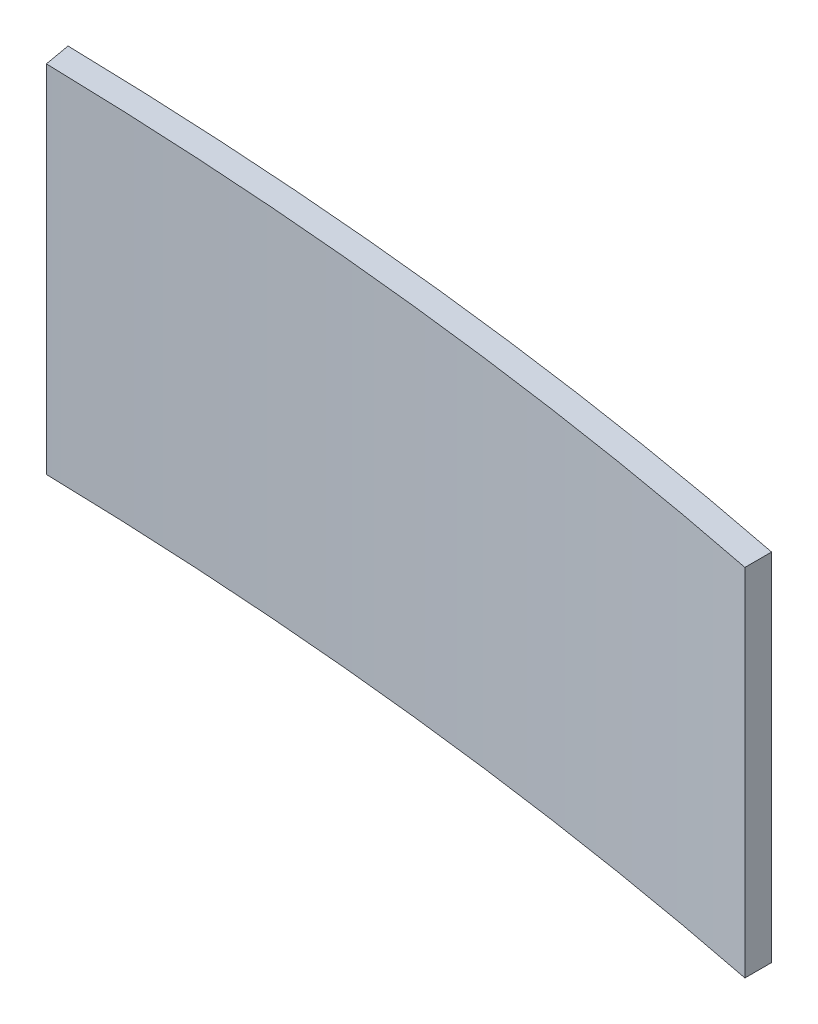
ISO-10303-21;
HEADER;
FILE_DESCRIPTION(('STEP AP214'),'2;1');
FILE_NAME('part.step','',(''),(''),'','','');
FILE_SCHEMA(('AUTOMOTIVE_DESIGN { 1 0 10303 214 1 1 1 1 }'));
ENDSEC;
DATA;
#1=APPLICATION_CONTEXT('core data for automotive mechanical design processes');
#2=APPLICATION_PROTOCOL_DEFINITION('international standard','automotive_design',2000,#1);
#3=PRODUCT_CONTEXT('',#1,'mechanical');
#4=PRODUCT('Part','Part','',(#3));
#5=PRODUCT_RELATED_PRODUCT_CATEGORY('part','',(#4));
#6=PRODUCT_DEFINITION_FORMATION('','',#4);
#7=PRODUCT_DEFINITION_CONTEXT('part definition',#1,'design');
#8=PRODUCT_DEFINITION('design','',#6,#7);
#9=PRODUCT_DEFINITION_SHAPE('','',#8);
#10=(LENGTH_UNIT() NAMED_UNIT(*) SI_UNIT(.MILLI.,.METRE.));
#11=(NAMED_UNIT(*) PLANE_ANGLE_UNIT() SI_UNIT($,.RADIAN.));
#12=(NAMED_UNIT(*) SI_UNIT($,.STERADIAN.) SOLID_ANGLE_UNIT());
#13=UNCERTAINTY_MEASURE_WITH_UNIT(LENGTH_MEASURE(1.E-05),#10,'distance_accuracy_value','');
#14=(GEOMETRIC_REPRESENTATION_CONTEXT(3) GLOBAL_UNCERTAINTY_ASSIGNED_CONTEXT((#13)) GLOBAL_UNIT_ASSIGNED_CONTEXT((#10,
#11,#12)) REPRESENTATION_CONTEXT('',''));
#15=CARTESIAN_POINT('',(0.,0.,0.));
#16=DIRECTION('',(0.,0.,1.));
#17=DIRECTION('',(1.,0.,0.));
#18=AXIS2_PLACEMENT_3D('',#15,#16,#17);
#19=CARTESIAN_POINT('',(-7.,-2.,52.1));
#20=DIRECTION('',(0.,-1.,0.));
#21=DIRECTION('',(0.,0.,-1.));
#22=AXIS2_PLACEMENT_3D('',#19,#20,#21);
#23=CYLINDRICAL_SURFACE('',#22,50.9901951359279);
#24=CARTESIAN_POINT('',(-7.,2.,52.1));
#25=DIRECTION('',(0.,-1.,0.));
#26=DIRECTION('',(0.196116135138184,0.,-0.98058067569092));
#27=AXIS2_PLACEMENT_3D('',#24,#25,#26);
#28=CIRCLE('',#27,50.9901951359279);
#29=CARTESIAN_POINT('',(-5.83433135322448,2.,1.12313057272018));
#30=VERTEX_POINT('',#29);
#31=CARTESIAN_POINT('',(3.,2.,2.1));
#32=VERTEX_POINT('',#31);
#33=EDGE_CURVE('E62',#30,#32,#28,.T.);
#34=ORIENTED_EDGE('',*,*,#33,.F.);
#35=DIRECTION('',(0.,-1.,0.));
#36=VECTOR('',#35,1.);
#37=CARTESIAN_POINT('',(-5.83433135322406,0.,1.12313057272001));
#38=LINE('',#37,#36);
#39=CARTESIAN_POINT('',(-5.83433135322439,-2.,1.12313057272024));
#40=VERTEX_POINT('',#39);
#41=EDGE_CURVE('E56',#30,#40,#38,.T.);
#42=ORIENTED_EDGE('',*,*,#41,.T.);
#43=CARTESIAN_POINT('',(-7.,-2.,52.1));
#44=DIRECTION('',(0.,-1.,0.));
#45=DIRECTION('',(0.196116135138184,0.,-0.98058067569092));
#46=AXIS2_PLACEMENT_3D('',#43,#44,#45);
#47=CIRCLE('',#46,50.9901951359279);
#48=CARTESIAN_POINT('',(3.,-2.,2.1));
#49=VERTEX_POINT('',#48);
#50=EDGE_CURVE('E21',#40,#49,#47,.T.);
#51=ORIENTED_EDGE('',*,*,#50,.T.);
#52=DIRECTION('',(0.,-1.,0.));
#53=VECTOR('',#52,1.);
#54=CARTESIAN_POINT('',(3.,0.,2.1));
#55=LINE('',#54,#53);
#56=EDGE_CURVE('E81',#32,#49,#55,.T.);
#57=ORIENTED_EDGE('',*,*,#56,.F.);
#58=EDGE_LOOP('',(#34,#42,#51,#57));
#59=FACE_BOUND('',#58,.T.);
#60=ADVANCED_FACE('F17',(#59),#23,.F.);
#61=CARTESIAN_POINT('',(3.,-2.,1.8));
#62=DIRECTION('',(0.,1.,0.));
#63=DIRECTION('',(0.,0.,1.));
#64=AXIS2_PLACEMENT_3D('',#61,#62,#63);
#65=PLANE('',#64);
#66=ORIENTED_EDGE('',*,*,#50,.F.);
#67=DIRECTION('',(-0.173648177662786,0.,-0.984807753012939));
#68=VECTOR('',#67,1.);
#69=CARTESIAN_POINT('',(-5.86037857987438,-2.,0.975409409768375));
#70=LINE('',#69,#68);
#71=CARTESIAN_POINT('',(-5.88642580652479,-2.,0.827688246816659));
#72=VERTEX_POINT('',#71);
#73=EDGE_CURVE('E64',#40,#72,#70,.T.);
#74=ORIENTED_EDGE('',*,*,#73,.T.);
#75=CARTESIAN_POINT('',(-7.,-2.,52.1));
#76=DIRECTION('',(0.,-1.,0.));
#77=DIRECTION('',(0.194991057671405,0.,-0.980805020087166));
#78=AXIS2_PLACEMENT_3D('',#75,#76,#77);
#79=CIRCLE('',#78,51.2844030870985);
#80=CARTESIAN_POINT('',(3.,-2.,1.8));
#81=VERTEX_POINT('',#80);
#82=EDGE_CURVE('E84',#81,#72,#79,.F.);
#83=ORIENTED_EDGE('',*,*,#82,.F.);
#84=DIRECTION('',(0.,0.,-1.));
#85=VECTOR('',#84,1.);
#86=CARTESIAN_POINT('',(3.,-2.,1.95));
#87=LINE('',#86,#85);
#88=EDGE_CURVE('E69',#49,#81,#87,.T.);
#89=ORIENTED_EDGE('',*,*,#88,.F.);
#90=EDGE_LOOP('',(#66,#74,#83,#89));
#91=FACE_BOUND('',#90,.T.);
#92=ADVANCED_FACE('F66',(#91),#65,.F.);
#93=CARTESIAN_POINT('',(-5.889030529189,-2.2,0.812916130521));
#94=DIRECTION('',(0.984807753012251,0.,-0.173648177666687));
#95=DIRECTION('',(0.,1.,0.));
#96=AXIS2_PLACEMENT_3D('',#93,#94,#95);
#97=PLANE('',#96);
#98=ORIENTED_EDGE('',*,*,#41,.F.);
#99=DIRECTION('',(0.173648177666941,0.,0.984807753012206));
#100=VECTOR('',#99,1.);
#101=CARTESIAN_POINT('',(-5.86037857987502,2.,0.975409409768448));
#102=LINE('',#101,#100);
#103=CARTESIAN_POINT('',(-5.88642580652457,2.,0.827688246816703));
#104=VERTEX_POINT('',#103);
#105=EDGE_CURVE('E75',#104,#30,#102,.T.);
#106=ORIENTED_EDGE('',*,*,#105,.F.);
#107=DIRECTION('',(0.,1.,0.));
#108=VECTOR('',#107,1.);
#109=CARTESIAN_POINT('',(-5.88642580652502,0.,0.82768824681662));
#110=LINE('',#109,#108);
#111=EDGE_CURVE('E73',#72,#104,#110,.T.);
#112=ORIENTED_EDGE('',*,*,#111,.F.);
#113=ORIENTED_EDGE('',*,*,#73,.F.);
#114=EDGE_LOOP('',(#98,#106,#112,#113));
#115=FACE_BOUND('',#114,.T.);
#116=ADVANCED_FACE('F71',(#115),#97,.F.);
#117=CARTESIAN_POINT('',(3.,2.,1.8));
#118=DIRECTION('',(0.,1.,0.));
#119=DIRECTION('',(0.,0.,1.));
#120=AXIS2_PLACEMENT_3D('',#117,#118,#119);
#121=PLANE('',#120);
#122=ORIENTED_EDGE('',*,*,#33,.T.);
#123=DIRECTION('',(0.,0.,1.));
#124=VECTOR('',#123,1.);
#125=CARTESIAN_POINT('',(3.,2.,1.95));
#126=LINE('',#125,#124);
#127=CARTESIAN_POINT('',(3.,2.,1.8));
#128=VERTEX_POINT('',#127);
#129=EDGE_CURVE('E36',#128,#32,#126,.T.);
#130=ORIENTED_EDGE('',*,*,#129,.F.);
#131=CARTESIAN_POINT('',(-7.,2.,52.1));
#132=DIRECTION('',(0.,-1.,0.));
#133=DIRECTION('',(0.194991057671405,0.,-0.980805020087166));
#134=AXIS2_PLACEMENT_3D('',#131,#132,#133);
#135=CIRCLE('',#134,51.2844030870985);
#136=EDGE_CURVE('E27',#104,#128,#135,.T.);
#137=ORIENTED_EDGE('',*,*,#136,.F.);
#138=ORIENTED_EDGE('',*,*,#105,.T.);
#139=EDGE_LOOP('',(#122,#130,#137,#138));
#140=FACE_BOUND('',#139,.T.);
#141=ADVANCED_FACE('F90',(#140),#121,.T.);
#142=CARTESIAN_POINT('',(3.,-2.2,1.785));
#143=DIRECTION('',(1.,0.,0.));
#144=DIRECTION('',(0.,1.,0.));
#145=AXIS2_PLACEMENT_3D('',#142,#143,#144);
#146=PLANE('',#145);
#147=ORIENTED_EDGE('',*,*,#56,.T.);
#148=ORIENTED_EDGE('',*,*,#88,.T.);
#149=DIRECTION('',(0.,-1.,0.));
#150=VECTOR('',#149,1.);
#151=CARTESIAN_POINT('',(3.,0.,1.8));
#152=LINE('',#151,#150);
#153=EDGE_CURVE('E11',#128,#81,#152,.T.);
#154=ORIENTED_EDGE('',*,*,#153,.F.);
#155=ORIENTED_EDGE('',*,*,#129,.T.);
#156=EDGE_LOOP('',(#147,#148,#154,#155));
#157=FACE_BOUND('',#156,.T.);
#158=ADVANCED_FACE('F19',(#157),#146,.T.);
#159=CARTESIAN_POINT('',(-7.,-2.,52.1));
#160=DIRECTION('',(0.,-1.,0.));
#161=DIRECTION('',(0.,0.,-1.));
#162=AXIS2_PLACEMENT_3D('',#159,#160,#161);
#163=CYLINDRICAL_SURFACE('',#162,51.2844030870985);
#164=ORIENTED_EDGE('',*,*,#136,.T.);
#165=ORIENTED_EDGE('',*,*,#153,.T.);
#166=ORIENTED_EDGE('',*,*,#82,.T.);
#167=ORIENTED_EDGE('',*,*,#111,.T.);
#168=EDGE_LOOP('',(#164,#165,#166,#167));
#169=FACE_BOUND('',#168,.T.);
#170=ADVANCED_FACE('F89',(#169),#163,.T.);
#171=CLOSED_SHELL('',(#60,#92,#116,#141,#158,#170));
#172=MANIFOLD_SOLID_BREP('B1',#171);
#173=ADVANCED_BREP_SHAPE_REPRESENTATION('',(#18,#172),#14);
#174=SHAPE_DEFINITION_REPRESENTATION(#9,#173);
ENDSEC;
END-ISO-10303-21;
